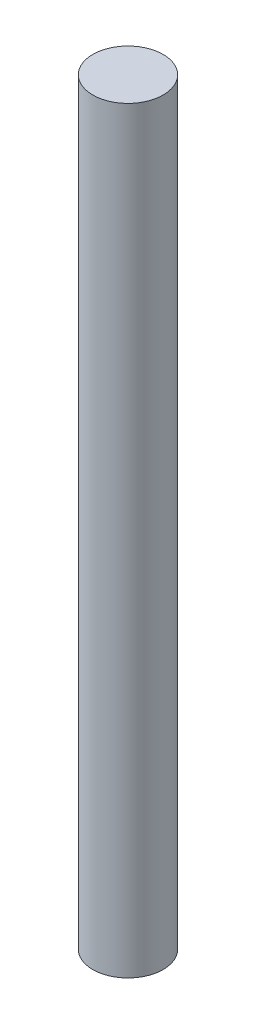
ISO-10303-21;
HEADER;
FILE_DESCRIPTION(('STEP AP214'),'2;1');
FILE_NAME('part.step','',(''),(''),'','','');
FILE_SCHEMA(('AUTOMOTIVE_DESIGN { 1 0 10303 214 1 1 1 1 }'));
ENDSEC;
DATA;
#1=APPLICATION_CONTEXT('core data for automotive mechanical design processes');
#2=APPLICATION_PROTOCOL_DEFINITION('international standard','automotive_design',2000,#1);
#3=PRODUCT_CONTEXT('',#1,'mechanical');
#4=PRODUCT('Part','Part','',(#3));
#5=PRODUCT_RELATED_PRODUCT_CATEGORY('part','',(#4));
#6=PRODUCT_DEFINITION_FORMATION('','',#4);
#7=PRODUCT_DEFINITION_CONTEXT('part definition',#1,'design');
#8=PRODUCT_DEFINITION('design','',#6,#7);
#9=PRODUCT_DEFINITION_SHAPE('','',#8);
#10=(LENGTH_UNIT() NAMED_UNIT(*) SI_UNIT(.MILLI.,.METRE.));
#11=(NAMED_UNIT(*) PLANE_ANGLE_UNIT() SI_UNIT($,.RADIAN.));
#12=(NAMED_UNIT(*) SI_UNIT($,.STERADIAN.) SOLID_ANGLE_UNIT());
#13=UNCERTAINTY_MEASURE_WITH_UNIT(LENGTH_MEASURE(1.E-05),#10,'distance_accuracy_value','');
#14=(GEOMETRIC_REPRESENTATION_CONTEXT(3) GLOBAL_UNCERTAINTY_ASSIGNED_CONTEXT((#13)) GLOBAL_UNIT_ASSIGNED_CONTEXT((#10,
#11,#12)) REPRESENTATION_CONTEXT('',''));
#15=CARTESIAN_POINT('',(0.,0.,0.));
#16=DIRECTION('',(0.,0.,1.));
#17=DIRECTION('',(1.,0.,0.));
#18=AXIS2_PLACEMENT_3D('',#15,#16,#17);
#19=CARTESIAN_POINT('',(48.5798240521689,700.,412.034943085406));
#20=DIRECTION('',(0.,-1.,0.));
#21=DIRECTION('',(0.,0.,-1.));
#22=AXIS2_PLACEMENT_3D('',#19,#20,#21);
#23=CYLINDRICAL_SURFACE('',#22,65.);
#24=CARTESIAN_POINT('',(48.5798240521689,700.,412.034943085406));
#25=DIRECTION('',(0.,1.,0.));
#26=DIRECTION('',(0.,0.,1.));
#27=AXIS2_PLACEMENT_3D('',#24,#25,#26);
#28=CIRCLE('',#27,65.);
#29=CARTESIAN_POINT('',(48.5798240521689,700.,477.034943085406));
#30=VERTEX_POINT('',#29);
#31=EDGE_CURVE('E10',#30,#30,#28,.T.);
#32=ORIENTED_EDGE('',*,*,#31,.F.);
#33=EDGE_LOOP('',(#32));
#34=FACE_BOUND('',#33,.T.);
#35=CARTESIAN_POINT('',(48.5798240521689,-700.,412.034943085406));
#36=DIRECTION('',(0.,1.,0.));
#37=DIRECTION('',(0.,0.,1.));
#38=AXIS2_PLACEMENT_3D('',#35,#36,#37);
#39=CIRCLE('',#38,65.);
#40=CARTESIAN_POINT('',(48.5798240521689,-700.,477.034943085406));
#41=VERTEX_POINT('',#40);
#42=EDGE_CURVE('E50',#41,#41,#39,.T.);
#43=ORIENTED_EDGE('',*,*,#42,.T.);
#44=EDGE_LOOP('',(#43));
#45=FACE_BOUND('',#44,.T.);
#46=ADVANCED_FACE('F43',(#34,#45),#23,.T.);
#47=CARTESIAN_POINT('',(48.5798240521689,700.,412.034943085406));
#48=DIRECTION('',(0.,1.,0.));
#49=DIRECTION('',(0.,0.,1.));
#50=AXIS2_PLACEMENT_3D('',#47,#48,#49);
#51=PLANE('',#50);
#52=ORIENTED_EDGE('',*,*,#31,.T.);
#53=EDGE_LOOP('',(#52));
#54=FACE_BOUND('',#53,.T.);
#55=ADVANCED_FACE('F60',(#54),#51,.T.);
#56=CARTESIAN_POINT('',(48.5798240521689,-700.,412.034943085406));
#57=DIRECTION('',(0.,-1.,0.));
#58=DIRECTION('',(0.,0.,1.));
#59=AXIS2_PLACEMENT_3D('',#56,#57,#58);
#60=PLANE('',#59);
#61=ORIENTED_EDGE('',*,*,#42,.F.);
#62=EDGE_LOOP('',(#61));
#63=FACE_BOUND('',#62,.T.);
#64=ADVANCED_FACE('F58',(#63),#60,.T.);
#65=CLOSED_SHELL('',(#46,#55,#64));
#66=MANIFOLD_SOLID_BREP('B2',#65);
#67=ADVANCED_BREP_SHAPE_REPRESENTATION('',(#18,#66),#14);
#68=SHAPE_DEFINITION_REPRESENTATION(#9,#67);
ENDSEC;
END-ISO-10303-21;
